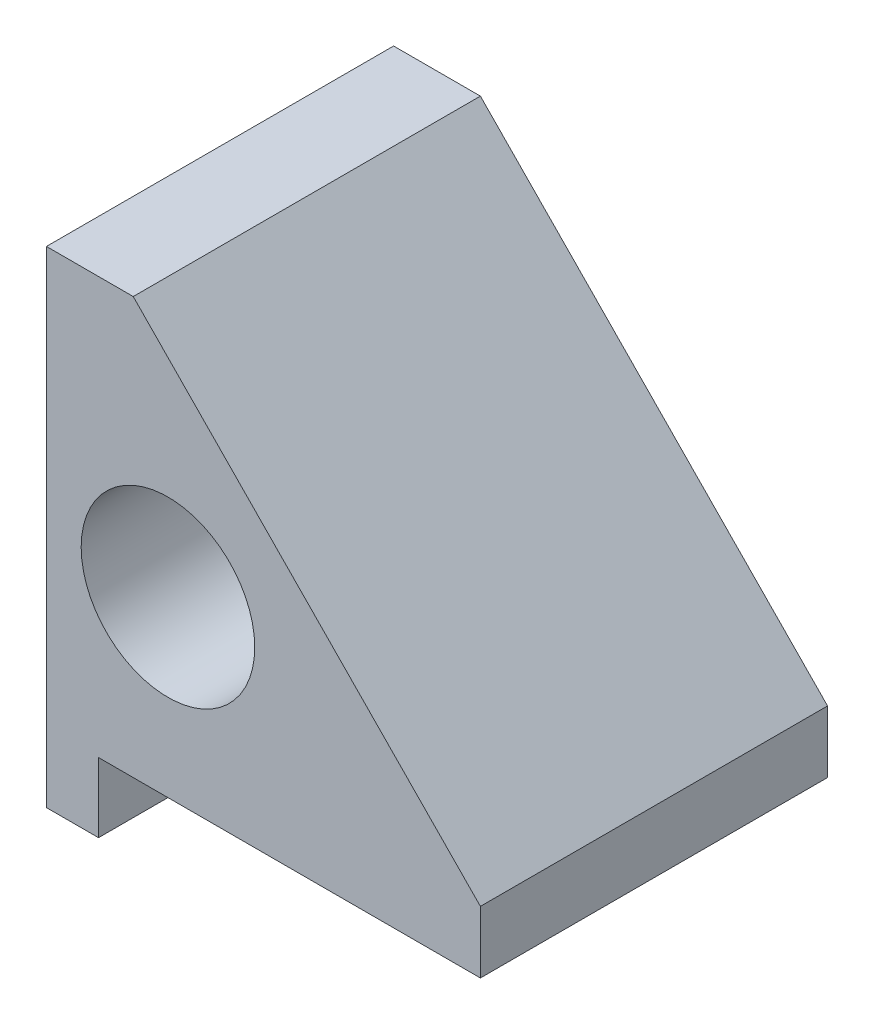
ISO-10303-21;
HEADER;
FILE_DESCRIPTION(('STEP AP214'),'2;1');
FILE_NAME('part.step','',(''),(''),'','','');
FILE_SCHEMA(('AUTOMOTIVE_DESIGN { 1 0 10303 214 1 1 1 1 }'));
ENDSEC;
DATA;
#1=APPLICATION_CONTEXT('core data for automotive mechanical design processes');
#2=APPLICATION_PROTOCOL_DEFINITION('international standard','automotive_design',2000,#1);
#3=PRODUCT_CONTEXT('',#1,'mechanical');
#4=PRODUCT('Part','Part','',(#3));
#5=PRODUCT_RELATED_PRODUCT_CATEGORY('part','',(#4));
#6=PRODUCT_DEFINITION_FORMATION('','',#4);
#7=PRODUCT_DEFINITION_CONTEXT('part definition',#1,'design');
#8=PRODUCT_DEFINITION('design','',#6,#7);
#9=PRODUCT_DEFINITION_SHAPE('','',#8);
#10=(LENGTH_UNIT() NAMED_UNIT(*) SI_UNIT(.MILLI.,.METRE.));
#11=(NAMED_UNIT(*) PLANE_ANGLE_UNIT() SI_UNIT($,.RADIAN.));
#12=(NAMED_UNIT(*) SI_UNIT($,.STERADIAN.) SOLID_ANGLE_UNIT());
#13=UNCERTAINTY_MEASURE_WITH_UNIT(LENGTH_MEASURE(1.E-05),#10,'distance_accuracy_value','');
#14=(GEOMETRIC_REPRESENTATION_CONTEXT(3) GLOBAL_UNCERTAINTY_ASSIGNED_CONTEXT((#13)) GLOBAL_UNIT_ASSIGNED_CONTEXT((#10,
#11,#12)) REPRESENTATION_CONTEXT('',''));
#15=CARTESIAN_POINT('',(0.,0.,0.));
#16=DIRECTION('',(0.,0.,1.));
#17=DIRECTION('',(1.,0.,0.));
#18=AXIS2_PLACEMENT_3D('',#15,#16,#17);
#19=CARTESIAN_POINT('',(0.,-4.,20.));
#20=DIRECTION('',(0.,0.,-1.));
#21=DIRECTION('',(-1.,0.,0.));
#22=AXIS2_PLACEMENT_3D('',#19,#20,#21);
#23=PLANE('',#22);
#24=DIRECTION('',(0.,1.,0.));
#25=VECTOR('',#24,1.);
#26=CARTESIAN_POINT('',(0.,-4.,20.));
#27=LINE('',#26,#25);
#28=CARTESIAN_POINT('',(0.,-4.,20.));
#29=VERTEX_POINT('',#28);
#30=CARTESIAN_POINT('',(0.,0.,20.));
#31=VERTEX_POINT('',#30);
#32=EDGE_CURVE('E124',#29,#31,#27,.T.);
#33=ORIENTED_EDGE('',*,*,#32,.T.);
#34=DIRECTION('',(1.,0.,0.));
#35=VECTOR('',#34,1.);
#36=CARTESIAN_POINT('',(0.,0.,20.));
#37=LINE('',#36,#35);
#38=CARTESIAN_POINT('',(22.,0.,20.));
#39=VERTEX_POINT('',#38);
#40=EDGE_CURVE('E95',#31,#39,#37,.T.);
#41=ORIENTED_EDGE('',*,*,#40,.T.);
#42=DIRECTION('',(0.,1.,0.));
#43=VECTOR('',#42,1.);
#44=CARTESIAN_POINT('',(22.,0.,20.));
#45=LINE('',#44,#43);
#46=CARTESIAN_POINT('',(22.,3.57446808510636,20.));
#47=VERTEX_POINT('',#46);
#48=EDGE_CURVE('E127',#39,#47,#45,.T.);
#49=ORIENTED_EDGE('',*,*,#48,.T.);
#50=DIRECTION('',(-0.699624792608213,0.714510426493494,0.));
#51=VECTOR('',#50,1.);
#52=CARTESIAN_POINT('',(22.,3.57446808510636,20.));
#53=LINE('',#52,#51);
#54=CARTESIAN_POINT('',(1.99999999999999,24.,20.));
#55=VERTEX_POINT('',#54);
#56=EDGE_CURVE('E130',#47,#55,#53,.T.);
#57=ORIENTED_EDGE('',*,*,#56,.T.);
#58=DIRECTION('',(-1.,0.,0.));
#59=VECTOR('',#58,1.);
#60=CARTESIAN_POINT('',(1.99999999999999,24.,20.));
#61=LINE('',#60,#59);
#62=CARTESIAN_POINT('',(-3.00000000000001,24.,20.));
#63=VERTEX_POINT('',#62);
#64=EDGE_CURVE('E133',#55,#63,#61,.T.);
#65=ORIENTED_EDGE('',*,*,#64,.T.);
#66=DIRECTION('',(0.,-1.,0.));
#67=VECTOR('',#66,1.);
#68=CARTESIAN_POINT('',(-3.00000000000001,24.,20.));
#69=LINE('',#68,#67);
#70=CARTESIAN_POINT('',(-3.00000000000001,-4.,20.));
#71=VERTEX_POINT('',#70);
#72=EDGE_CURVE('E136',#63,#71,#69,.T.);
#73=ORIENTED_EDGE('',*,*,#72,.T.);
#74=DIRECTION('',(1.,0.,0.));
#75=VECTOR('',#74,1.);
#76=CARTESIAN_POINT('',(-3.00000000000001,-4.,20.));
#77=LINE('',#76,#75);
#78=EDGE_CURVE('E138',#71,#29,#77,.T.);
#79=ORIENTED_EDGE('',*,*,#78,.T.);
#80=EDGE_LOOP('',(#33,#41,#49,#57,#65,#73,#79));
#81=FACE_BOUND('',#80,.T.);
#82=CARTESIAN_POINT('',(3.99999999999999,10.,20.));
#83=DIRECTION('',(0.,0.,1.));
#84=DIRECTION('',(1.,0.,0.));
#85=AXIS2_PLACEMENT_3D('',#82,#83,#84);
#86=CIRCLE('',#85,5.);
#87=CARTESIAN_POINT('',(8.99999999999999,10.,20.));
#88=VERTEX_POINT('',#87);
#89=EDGE_CURVE('E103',#88,#88,#86,.T.);
#90=ORIENTED_EDGE('',*,*,#89,.F.);
#91=EDGE_LOOP('',(#90));
#92=FACE_BOUND('',#91,.T.);
#93=ADVANCED_FACE('F30',(#81,#92),#23,.F.);
#94=CARTESIAN_POINT('',(0.,-4.,0.));
#95=DIRECTION('',(0.,0.,-1.));
#96=DIRECTION('',(-1.,0.,0.));
#97=AXIS2_PLACEMENT_3D('',#94,#95,#96);
#98=PLANE('',#97);
#99=DIRECTION('',(0.,1.,0.));
#100=VECTOR('',#99,1.);
#101=CARTESIAN_POINT('',(0.,-4.,0.));
#102=LINE('',#101,#100);
#103=CARTESIAN_POINT('',(0.,-4.,0.));
#104=VERTEX_POINT('',#103);
#105=CARTESIAN_POINT('',(0.,0.,0.));
#106=VERTEX_POINT('',#105);
#107=EDGE_CURVE('E99',#104,#106,#102,.T.);
#108=ORIENTED_EDGE('',*,*,#107,.F.);
#109=DIRECTION('',(1.,0.,0.));
#110=VECTOR('',#109,1.);
#111=CARTESIAN_POINT('',(-3.00000000000001,-4.,0.));
#112=LINE('',#111,#110);
#113=CARTESIAN_POINT('',(-3.00000000000001,-4.,0.));
#114=VERTEX_POINT('',#113);
#115=EDGE_CURVE('E122',#114,#104,#112,.T.);
#116=ORIENTED_EDGE('',*,*,#115,.F.);
#117=DIRECTION('',(0.,-1.,0.));
#118=VECTOR('',#117,1.);
#119=CARTESIAN_POINT('',(-3.00000000000001,24.,0.));
#120=LINE('',#119,#118);
#121=CARTESIAN_POINT('',(-3.00000000000001,24.,0.));
#122=VERTEX_POINT('',#121);
#123=EDGE_CURVE('E120',#122,#114,#120,.T.);
#124=ORIENTED_EDGE('',*,*,#123,.F.);
#125=DIRECTION('',(-1.,0.,0.));
#126=VECTOR('',#125,1.);
#127=CARTESIAN_POINT('',(1.99999999999999,24.,0.));
#128=LINE('',#127,#126);
#129=CARTESIAN_POINT('',(1.99999999999999,24.,0.));
#130=VERTEX_POINT('',#129);
#131=EDGE_CURVE('E117',#130,#122,#128,.T.);
#132=ORIENTED_EDGE('',*,*,#131,.F.);
#133=DIRECTION('',(-0.699624792608213,0.714510426493494,0.));
#134=VECTOR('',#133,1.);
#135=CARTESIAN_POINT('',(22.,3.57446808510636,0.));
#136=LINE('',#135,#134);
#137=CARTESIAN_POINT('',(22.,3.57446808510636,0.));
#138=VERTEX_POINT('',#137);
#139=EDGE_CURVE('E111',#138,#130,#136,.T.);
#140=ORIENTED_EDGE('',*,*,#139,.F.);
#141=DIRECTION('',(0.,1.,0.));
#142=VECTOR('',#141,1.);
#143=CARTESIAN_POINT('',(22.,0.,0.));
#144=LINE('',#143,#142);
#145=CARTESIAN_POINT('',(22.,0.,0.));
#146=VERTEX_POINT('',#145);
#147=EDGE_CURVE('E109',#146,#138,#144,.T.);
#148=ORIENTED_EDGE('',*,*,#147,.F.);
#149=DIRECTION('',(1.,0.,0.));
#150=VECTOR('',#149,1.);
#151=CARTESIAN_POINT('',(0.,0.,0.));
#152=LINE('',#151,#150);
#153=EDGE_CURVE('E92',#106,#146,#152,.T.);
#154=ORIENTED_EDGE('',*,*,#153,.F.);
#155=EDGE_LOOP('',(#108,#116,#124,#132,#140,#148,#154));
#156=FACE_BOUND('',#155,.T.);
#157=CARTESIAN_POINT('',(3.99999999999999,10.,0.));
#158=DIRECTION('',(0.,0.,1.));
#159=DIRECTION('',(1.,0.,0.));
#160=AXIS2_PLACEMENT_3D('',#157,#158,#159);
#161=CIRCLE('',#160,5.);
#162=CARTESIAN_POINT('',(8.99999999999999,10.,0.));
#163=VERTEX_POINT('',#162);
#164=EDGE_CURVE('E248',#163,#163,#161,.T.);
#165=ORIENTED_EDGE('',*,*,#164,.T.);
#166=EDGE_LOOP('',(#165));
#167=FACE_BOUND('',#166,.T.);
#168=ADVANCED_FACE('F105',(#156,#167),#98,.T.);
#169=CARTESIAN_POINT('',(0.,-4.,20.));
#170=DIRECTION('',(-1.,0.,0.));
#171=DIRECTION('',(0.,-1.,0.));
#172=AXIS2_PLACEMENT_3D('',#169,#170,#171);
#173=PLANE('',#172);
#174=DIRECTION('',(0.,0.,-1.));
#175=VECTOR('',#174,1.);
#176=CARTESIAN_POINT('',(0.,0.,20.));
#177=LINE('',#176,#175);
#178=EDGE_CURVE('E11',#31,#106,#177,.T.);
#179=ORIENTED_EDGE('',*,*,#178,.F.);
#180=ORIENTED_EDGE('',*,*,#32,.F.);
#181=DIRECTION('',(0.,0.,-1.));
#182=VECTOR('',#181,1.);
#183=CARTESIAN_POINT('',(0.,-4.,20.));
#184=LINE('',#183,#182);
#185=EDGE_CURVE('E45',#29,#104,#184,.T.);
#186=ORIENTED_EDGE('',*,*,#185,.T.);
#187=ORIENTED_EDGE('',*,*,#107,.T.);
#188=EDGE_LOOP('',(#179,#180,#186,#187));
#189=FACE_BOUND('',#188,.T.);
#190=ADVANCED_FACE('F100',(#189),#173,.F.);
#191=CARTESIAN_POINT('',(0.,0.,20.));
#192=DIRECTION('',(0.,1.,0.));
#193=DIRECTION('',(0.,0.,1.));
#194=AXIS2_PLACEMENT_3D('',#191,#192,#193);
#195=PLANE('',#194);
#196=DIRECTION('',(0.,0.,-1.));
#197=VECTOR('',#196,1.);
#198=CARTESIAN_POINT('',(22.,0.,20.));
#199=LINE('',#198,#197);
#200=EDGE_CURVE('E38',#39,#146,#199,.T.);
#201=ORIENTED_EDGE('',*,*,#200,.F.);
#202=ORIENTED_EDGE('',*,*,#40,.F.);
#203=ORIENTED_EDGE('',*,*,#178,.T.);
#204=ORIENTED_EDGE('',*,*,#153,.T.);
#205=EDGE_LOOP('',(#201,#202,#203,#204));
#206=FACE_BOUND('',#205,.T.);
#207=ADVANCED_FACE('F32',(#206),#195,.F.);
#208=CARTESIAN_POINT('',(22.,0.,20.));
#209=DIRECTION('',(-1.,0.,0.));
#210=DIRECTION('',(0.,-1.,0.));
#211=AXIS2_PLACEMENT_3D('',#208,#209,#210);
#212=PLANE('',#211);
#213=DIRECTION('',(0.,0.,-1.));
#214=VECTOR('',#213,1.);
#215=CARTESIAN_POINT('',(22.,3.57446808510636,20.));
#216=LINE('',#215,#214);
#217=EDGE_CURVE('E147',#47,#138,#216,.T.);
#218=ORIENTED_EDGE('',*,*,#217,.F.);
#219=ORIENTED_EDGE('',*,*,#48,.F.);
#220=ORIENTED_EDGE('',*,*,#200,.T.);
#221=ORIENTED_EDGE('',*,*,#147,.T.);
#222=EDGE_LOOP('',(#218,#219,#220,#221));
#223=FACE_BOUND('',#222,.T.);
#224=ADVANCED_FACE('F150',(#223),#212,.F.);
#225=CARTESIAN_POINT('',(22.,3.57446808510636,20.));
#226=DIRECTION('',(-0.714510426493494,-0.699624792608213,0.));
#227=DIRECTION('',(0.699624792608213,-0.714510426493494,0.));
#228=AXIS2_PLACEMENT_3D('',#225,#226,#227);
#229=PLANE('',#228);
#230=DIRECTION('',(0.,0.,-1.));
#231=VECTOR('',#230,1.);
#232=CARTESIAN_POINT('',(1.99999999999999,24.,20.));
#233=LINE('',#232,#231);
#234=EDGE_CURVE('E145',#55,#130,#233,.T.);
#235=ORIENTED_EDGE('',*,*,#234,.F.);
#236=ORIENTED_EDGE('',*,*,#56,.F.);
#237=ORIENTED_EDGE('',*,*,#217,.T.);
#238=ORIENTED_EDGE('',*,*,#139,.T.);
#239=EDGE_LOOP('',(#235,#236,#237,#238));
#240=FACE_BOUND('',#239,.T.);
#241=ADVANCED_FACE('F162',(#240),#229,.F.);
#242=CARTESIAN_POINT('',(1.99999999999999,24.,20.));
#243=DIRECTION('',(0.,-1.,0.));
#244=DIRECTION('',(0.,0.,-1.));
#245=AXIS2_PLACEMENT_3D('',#242,#243,#244);
#246=PLANE('',#245);
#247=DIRECTION('',(0.,0.,-1.));
#248=VECTOR('',#247,1.);
#249=CARTESIAN_POINT('',(-3.00000000000001,24.,20.));
#250=LINE('',#249,#248);
#251=EDGE_CURVE('E143',#63,#122,#250,.T.);
#252=ORIENTED_EDGE('',*,*,#251,.F.);
#253=ORIENTED_EDGE('',*,*,#64,.F.);
#254=ORIENTED_EDGE('',*,*,#234,.T.);
#255=ORIENTED_EDGE('',*,*,#131,.T.);
#256=EDGE_LOOP('',(#252,#253,#254,#255));
#257=FACE_BOUND('',#256,.T.);
#258=ADVANCED_FACE('F159',(#257),#246,.F.);
#259=CARTESIAN_POINT('',(-3.00000000000001,24.,20.));
#260=DIRECTION('',(1.,0.,0.));
#261=DIRECTION('',(0.,1.,0.));
#262=AXIS2_PLACEMENT_3D('',#259,#260,#261);
#263=PLANE('',#262);
#264=DIRECTION('',(0.,0.,-1.));
#265=VECTOR('',#264,1.);
#266=CARTESIAN_POINT('',(-3.00000000000001,-4.,20.));
#267=LINE('',#266,#265);
#268=EDGE_CURVE('E53',#71,#114,#267,.T.);
#269=ORIENTED_EDGE('',*,*,#268,.F.);
#270=ORIENTED_EDGE('',*,*,#72,.F.);
#271=ORIENTED_EDGE('',*,*,#251,.T.);
#272=ORIENTED_EDGE('',*,*,#123,.T.);
#273=EDGE_LOOP('',(#269,#270,#271,#272));
#274=FACE_BOUND('',#273,.T.);
#275=ADVANCED_FACE('F156',(#274),#263,.F.);
#276=CARTESIAN_POINT('',(-3.00000000000001,-4.,20.));
#277=DIRECTION('',(0.,1.,0.));
#278=DIRECTION('',(-1.,0.,0.));
#279=AXIS2_PLACEMENT_3D('',#276,#277,#278);
#280=PLANE('',#279);
#281=ORIENTED_EDGE('',*,*,#78,.F.);
#282=ORIENTED_EDGE('',*,*,#268,.T.);
#283=ORIENTED_EDGE('',*,*,#115,.T.);
#284=ORIENTED_EDGE('',*,*,#185,.F.);
#285=EDGE_LOOP('',(#281,#282,#283,#284));
#286=FACE_BOUND('',#285,.T.);
#287=ADVANCED_FACE('F154',(#286),#280,.F.);
#288=CARTESIAN_POINT('',(3.99999999999999,10.,20.));
#289=DIRECTION('',(0.,0.,-1.));
#290=DIRECTION('',(-1.,0.,0.));
#291=AXIS2_PLACEMENT_3D('',#288,#289,#290);
#292=CYLINDRICAL_SURFACE('',#291,5.);
#293=ORIENTED_EDGE('',*,*,#89,.T.);
#294=EDGE_LOOP('',(#293));
#295=FACE_BOUND('',#294,.T.);
#296=ORIENTED_EDGE('',*,*,#164,.F.);
#297=EDGE_LOOP('',(#296));
#298=FACE_BOUND('',#297,.T.);
#299=ADVANCED_FACE('F182',(#295,#298),#292,.F.);
#300=CLOSED_SHELL('',(#93,#168,#190,#207,#224,#241,#258,#275,#287,#299));
#301=MANIFOLD_SOLID_BREP('B2',#300);
#302=ADVANCED_BREP_SHAPE_REPRESENTATION('',(#18,#301),#14);
#303=SHAPE_DEFINITION_REPRESENTATION(#9,#302);
ENDSEC;
END-ISO-10303-21;
